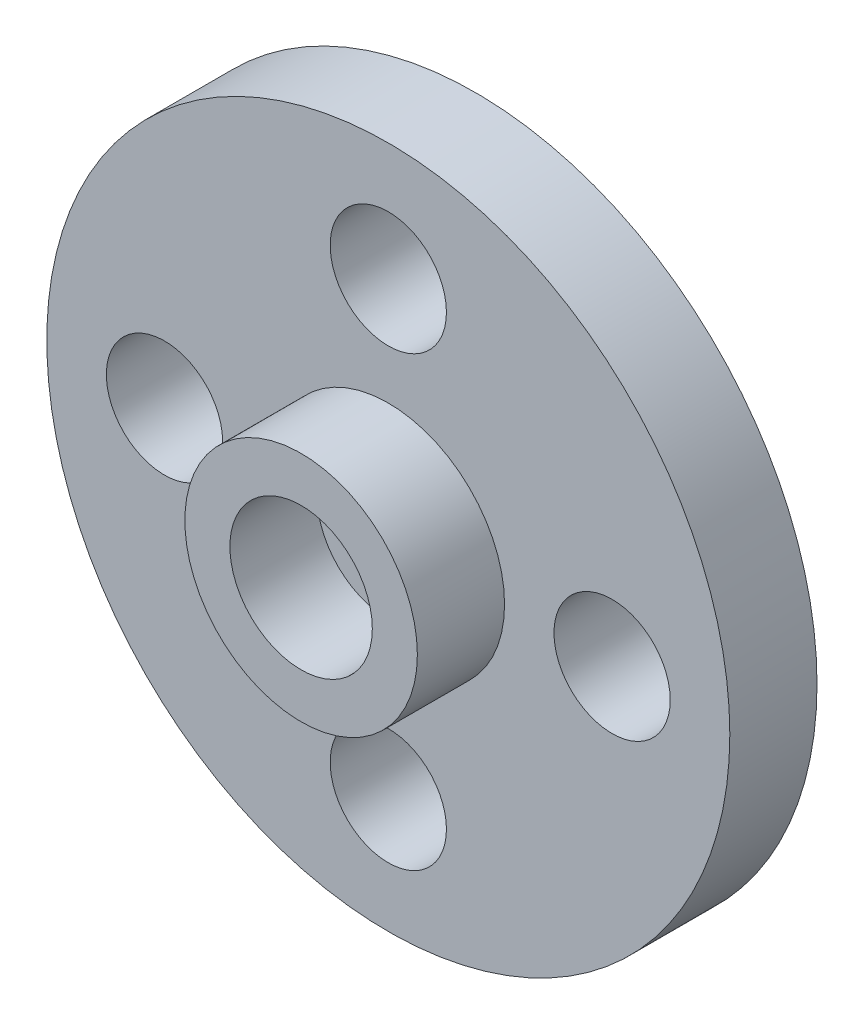
ISO-10303-21;
HEADER;
FILE_DESCRIPTION(('STEP AP214'),'2;1');
FILE_NAME('part.step','',(''),(''),'','','');
FILE_SCHEMA(('AUTOMOTIVE_DESIGN { 1 0 10303 214 1 1 1 1 }'));
ENDSEC;
DATA;
#1=APPLICATION_CONTEXT('core data for automotive mechanical design processes');
#2=APPLICATION_PROTOCOL_DEFINITION('international standard','automotive_design',2000,#1);
#3=PRODUCT_CONTEXT('',#1,'mechanical');
#4=PRODUCT('Part','Part','',(#3));
#5=PRODUCT_RELATED_PRODUCT_CATEGORY('part','',(#4));
#6=PRODUCT_DEFINITION_FORMATION('','',#4);
#7=PRODUCT_DEFINITION_CONTEXT('part definition',#1,'design');
#8=PRODUCT_DEFINITION('design','',#6,#7);
#9=PRODUCT_DEFINITION_SHAPE('','',#8);
#10=(LENGTH_UNIT() NAMED_UNIT(*) SI_UNIT(.MILLI.,.METRE.));
#11=(NAMED_UNIT(*) PLANE_ANGLE_UNIT() SI_UNIT($,.RADIAN.));
#12=(NAMED_UNIT(*) SI_UNIT($,.STERADIAN.) SOLID_ANGLE_UNIT());
#13=UNCERTAINTY_MEASURE_WITH_UNIT(LENGTH_MEASURE(1.E-05),#10,'distance_accuracy_value','');
#14=(GEOMETRIC_REPRESENTATION_CONTEXT(3) GLOBAL_UNCERTAINTY_ASSIGNED_CONTEXT((#13)) GLOBAL_UNIT_ASSIGNED_CONTEXT((#10,
#11,#12)) REPRESENTATION_CONTEXT('',''));
#15=CARTESIAN_POINT('',(0.,0.,0.));
#16=DIRECTION('',(0.,0.,1.));
#17=DIRECTION('',(1.,0.,0.));
#18=AXIS2_PLACEMENT_3D('',#15,#16,#17);
#19=CARTESIAN_POINT('',(0.,0.,-3.));
#20=DIRECTION('',(0.,0.,1.));
#21=DIRECTION('',(1.,0.,0.));
#22=AXIS2_PLACEMENT_3D('',#19,#20,#21);
#23=CYLINDRICAL_SURFACE('',#22,11.75);
#24=CARTESIAN_POINT('',(0.,0.,-3.));
#25=DIRECTION('',(0.,0.,1.));
#26=DIRECTION('',(1.,0.,0.));
#27=AXIS2_PLACEMENT_3D('',#24,#25,#26);
#28=CIRCLE('',#27,11.75);
#29=CARTESIAN_POINT('',(11.75,0.,-3.));
#30=VERTEX_POINT('',#29);
#31=EDGE_CURVE('E47',#30,#30,#28,.T.);
#32=ORIENTED_EDGE('',*,*,#31,.T.);
#33=EDGE_LOOP('',(#32));
#34=FACE_BOUND('',#33,.T.);
#35=CARTESIAN_POINT('',(0.,0.,0.));
#36=DIRECTION('',(0.,0.,1.));
#37=DIRECTION('',(1.,0.,0.));
#38=AXIS2_PLACEMENT_3D('',#35,#36,#37);
#39=CIRCLE('',#38,11.75);
#40=CARTESIAN_POINT('',(11.75,0.,0.));
#41=VERTEX_POINT('',#40);
#42=EDGE_CURVE('E51',#41,#41,#39,.T.);
#43=ORIENTED_EDGE('',*,*,#42,.F.);
#44=EDGE_LOOP('',(#43));
#45=FACE_BOUND('',#44,.T.);
#46=ADVANCED_FACE('F41',(#34,#45),#23,.T.);
#47=CARTESIAN_POINT('',(0.,0.,-3.));
#48=DIRECTION('',(0.,0.,1.));
#49=DIRECTION('',(1.,0.,0.));
#50=AXIS2_PLACEMENT_3D('',#47,#48,#49);
#51=PLANE('',#50);
#52=CARTESIAN_POINT('',(0.,7.7,-3.));
#53=DIRECTION('',(0.,0.,1.));
#54=DIRECTION('',(1.,0.,0.));
#55=AXIS2_PLACEMENT_3D('',#52,#53,#54);
#56=CIRCLE('',#55,2.);
#57=CARTESIAN_POINT('',(2.,7.7,-3.));
#58=VERTEX_POINT('',#57);
#59=EDGE_CURVE('E66',#58,#58,#56,.F.);
#60=ORIENTED_EDGE('',*,*,#59,.F.);
#61=EDGE_LOOP('',(#60));
#62=FACE_BOUND('',#61,.T.);
#63=CARTESIAN_POINT('',(7.70000000000011,1.05675171732646E-13,-3.));
#64=DIRECTION('',(0.,0.,1.));
#65=DIRECTION('',(1.,0.,0.));
#66=AXIS2_PLACEMENT_3D('',#63,#64,#65);
#67=CIRCLE('',#66,2.);
#68=CARTESIAN_POINT('',(9.70000000000011,1.05675171732646E-13,-3.));
#69=VERTEX_POINT('',#68);
#70=EDGE_CURVE('E82',#69,#69,#67,.F.);
#71=ORIENTED_EDGE('',*,*,#70,.F.);
#72=EDGE_LOOP('',(#71));
#73=FACE_BOUND('',#72,.T.);
#74=CARTESIAN_POINT('',(2.11350343465292E-13,-7.7,-3.));
#75=DIRECTION('',(0.,0.,1.));
#76=DIRECTION('',(1.,0.,0.));
#77=AXIS2_PLACEMENT_3D('',#74,#75,#76);
#78=CIRCLE('',#77,2.);
#79=CARTESIAN_POINT('',(2.00000000000021,-7.7,-3.));
#80=VERTEX_POINT('',#79);
#81=EDGE_CURVE('E76',#80,#80,#78,.F.);
#82=ORIENTED_EDGE('',*,*,#81,.F.);
#83=EDGE_LOOP('',(#82));
#84=FACE_BOUND('',#83,.T.);
#85=CARTESIAN_POINT('',(-7.6999999999999,-1.06618149767989E-13,-3.));
#86=DIRECTION('',(0.,0.,1.));
#87=DIRECTION('',(1.,0.,0.));
#88=AXIS2_PLACEMENT_3D('',#85,#86,#87);
#89=CIRCLE('',#88,2.);
#90=CARTESIAN_POINT('',(-5.69999999999989,-1.06618149767989E-13,-3.));
#91=VERTEX_POINT('',#90);
#92=EDGE_CURVE('E67',#91,#91,#89,.F.);
#93=ORIENTED_EDGE('',*,*,#92,.F.);
#94=EDGE_LOOP('',(#93));
#95=FACE_BOUND('',#94,.T.);
#96=ORIENTED_EDGE('',*,*,#31,.F.);
#97=EDGE_LOOP('',(#96));
#98=FACE_BOUND('',#97,.T.);
#99=ADVANCED_FACE('F100',(#62,#73,#84,#95,#98),#51,.F.);
#100=CARTESIAN_POINT('',(0.,0.,0.));
#101=DIRECTION('',(0.,0.,1.));
#102=DIRECTION('',(1.,0.,0.));
#103=AXIS2_PLACEMENT_3D('',#100,#101,#102);
#104=PLANE('',#103);
#105=CARTESIAN_POINT('',(0.,7.7,0.));
#106=DIRECTION('',(0.,0.,1.));
#107=DIRECTION('',(1.,0.,0.));
#108=AXIS2_PLACEMENT_3D('',#105,#106,#107);
#109=CIRCLE('',#108,2.);
#110=CARTESIAN_POINT('',(2.,7.7,0.));
#111=VERTEX_POINT('',#110);
#112=EDGE_CURVE('E85',#111,#111,#109,.T.);
#113=ORIENTED_EDGE('',*,*,#112,.F.);
#114=EDGE_LOOP('',(#113));
#115=FACE_BOUND('',#114,.T.);
#116=CARTESIAN_POINT('',(7.70000000000011,1.05675171732646E-13,0.));
#117=DIRECTION('',(0.,0.,1.));
#118=DIRECTION('',(1.,0.,0.));
#119=AXIS2_PLACEMENT_3D('',#116,#117,#118);
#120=CIRCLE('',#119,2.);
#121=CARTESIAN_POINT('',(9.70000000000011,1.05675171732646E-13,0.));
#122=VERTEX_POINT('',#121);
#123=EDGE_CURVE('E79',#122,#122,#120,.T.);
#124=ORIENTED_EDGE('',*,*,#123,.F.);
#125=EDGE_LOOP('',(#124));
#126=FACE_BOUND('',#125,.T.);
#127=CARTESIAN_POINT('',(2.11350343465292E-13,-7.7,0.));
#128=DIRECTION('',(0.,0.,1.));
#129=DIRECTION('',(1.,0.,0.));
#130=AXIS2_PLACEMENT_3D('',#127,#128,#129);
#131=CIRCLE('',#130,2.);
#132=CARTESIAN_POINT('',(2.00000000000021,-7.7,0.));
#133=VERTEX_POINT('',#132);
#134=EDGE_CURVE('E71',#133,#133,#131,.T.);
#135=ORIENTED_EDGE('',*,*,#134,.F.);
#136=EDGE_LOOP('',(#135));
#137=FACE_BOUND('',#136,.T.);
#138=CARTESIAN_POINT('',(-7.6999999999999,-1.06618149767989E-13,0.));
#139=DIRECTION('',(0.,0.,1.));
#140=DIRECTION('',(1.,0.,0.));
#141=AXIS2_PLACEMENT_3D('',#138,#139,#140);
#142=CIRCLE('',#141,2.);
#143=CARTESIAN_POINT('',(-5.69999999999989,-1.06618149767989E-13,0.));
#144=VERTEX_POINT('',#143);
#145=EDGE_CURVE('E72',#144,#144,#142,.T.);
#146=ORIENTED_EDGE('',*,*,#145,.F.);
#147=EDGE_LOOP('',(#146));
#148=FACE_BOUND('',#147,.T.);
#149=CARTESIAN_POINT('',(0.,0.,0.));
#150=DIRECTION('',(0.,0.,1.));
#151=DIRECTION('',(1.,0.,0.));
#152=AXIS2_PLACEMENT_3D('',#149,#150,#151);
#153=CIRCLE('',#152,4.);
#154=CARTESIAN_POINT('',(4.,0.,0.));
#155=VERTEX_POINT('',#154);
#156=EDGE_CURVE('E58',#155,#155,#153,.T.);
#157=ORIENTED_EDGE('',*,*,#156,.F.);
#158=EDGE_LOOP('',(#157));
#159=FACE_BOUND('',#158,.T.);
#160=ORIENTED_EDGE('',*,*,#42,.T.);
#161=EDGE_LOOP('',(#160));
#162=FACE_BOUND('',#161,.T.);
#163=ADVANCED_FACE('F96',(#115,#126,#137,#148,#159,#162),#104,.T.);
#164=CARTESIAN_POINT('',(0.,0.,3.));
#165=DIRECTION('',(0.,0.,1.));
#166=DIRECTION('',(1.,0.,0.));
#167=AXIS2_PLACEMENT_3D('',#164,#165,#166);
#168=PLANE('',#167);
#169=CARTESIAN_POINT('',(0.,0.,3.));
#170=DIRECTION('',(0.,0.,1.));
#171=DIRECTION('',(1.,0.,0.));
#172=AXIS2_PLACEMENT_3D('',#169,#170,#171);
#173=CIRCLE('',#172,4.);
#174=CARTESIAN_POINT('',(4.,0.,3.));
#175=VERTEX_POINT('',#174);
#176=EDGE_CURVE('E56',#175,#175,#173,.T.);
#177=ORIENTED_EDGE('',*,*,#176,.T.);
#178=EDGE_LOOP('',(#177));
#179=FACE_BOUND('',#178,.T.);
#180=CARTESIAN_POINT('',(0.,0.,3.));
#181=DIRECTION('',(0.,0.,1.));
#182=DIRECTION('',(1.,0.,0.));
#183=AXIS2_PLACEMENT_3D('',#180,#181,#182);
#184=CIRCLE('',#183,2.45);
#185=CARTESIAN_POINT('',(2.45,0.,3.));
#186=VERTEX_POINT('',#185);
#187=EDGE_CURVE('E61',#186,#186,#184,.T.);
#188=ORIENTED_EDGE('',*,*,#187,.F.);
#189=EDGE_LOOP('',(#188));
#190=FACE_BOUND('',#189,.T.);
#191=ADVANCED_FACE('F99',(#179,#190),#168,.T.);
#192=CARTESIAN_POINT('',(0.,0.,3.));
#193=DIRECTION('',(0.,0.,-1.));
#194=DIRECTION('',(-1.,0.,0.));
#195=AXIS2_PLACEMENT_3D('',#192,#193,#194);
#196=CYLINDRICAL_SURFACE('',#195,4.);
#197=ORIENTED_EDGE('',*,*,#176,.F.);
#198=EDGE_LOOP('',(#197));
#199=FACE_BOUND('',#198,.T.);
#200=ORIENTED_EDGE('',*,*,#156,.T.);
#201=EDGE_LOOP('',(#200));
#202=FACE_BOUND('',#201,.T.);
#203=ADVANCED_FACE('F123',(#199,#202),#196,.T.);
#204=CARTESIAN_POINT('',(0.,0.,3.));
#205=DIRECTION('',(0.,0.,-1.));
#206=DIRECTION('',(-1.,0.,0.));
#207=AXIS2_PLACEMENT_3D('',#204,#205,#206);
#208=CYLINDRICAL_SURFACE('',#207,2.45);
#209=ORIENTED_EDGE('',*,*,#187,.T.);
#210=EDGE_LOOP('',(#209));
#211=FACE_BOUND('',#210,.T.);
#212=CARTESIAN_POINT('',(0.,0.,0.));
#213=DIRECTION('',(0.,0.,1.));
#214=DIRECTION('',(1.,0.,0.));
#215=AXIS2_PLACEMENT_3D('',#212,#213,#214);
#216=CIRCLE('',#215,2.45);
#217=CARTESIAN_POINT('',(2.45,0.,0.));
#218=VERTEX_POINT('',#217);
#219=EDGE_CURVE('E10',#218,#218,#216,.F.);
#220=ORIENTED_EDGE('',*,*,#219,.T.);
#221=EDGE_LOOP('',(#220));
#222=FACE_BOUND('',#221,.T.);
#223=ADVANCED_FACE('F126',(#211,#222),#208,.F.);
#224=ORIENTED_EDGE('',*,*,#219,.F.);
#225=EDGE_LOOP('',(#224));
#226=FACE_BOUND('',#225,.T.);
#227=ADVANCED_FACE('F101',(#226),#104,.T.);
#228=CARTESIAN_POINT('',(-7.6999999999999,-1.06618149767989E-13,-3.001));
#229=DIRECTION('',(0.,0.,1.));
#230=DIRECTION('',(1.,0.,0.));
#231=AXIS2_PLACEMENT_3D('',#228,#229,#230);
#232=CYLINDRICAL_SURFACE('',#231,2.);
#233=CARTESIAN_POINT('',(-5.69999999999989,-1.06618149767989E-13,0.));
#234=CARTESIAN_POINT('',(-5.69999999999989,-1.06618149767989E-13,-0.0312500000000005));
#235=CARTESIAN_POINT('',(-5.69999999999989,-1.06618149767989E-13,-0.0625000000000005));
#236=CARTESIAN_POINT('',(-5.69999999999989,-1.06618149767989E-13,-0.125000000000001));
#237=CARTESIAN_POINT('',(-5.69999999999989,-1.06618149767989E-13,-0.156250000000001));
#238=CARTESIAN_POINT('',(-5.69999999999989,-1.06618149767989E-13,-0.218750000000001));
#239=CARTESIAN_POINT('',(-5.69999999999989,-1.06618149767989E-13,-0.250000000000001));
#240=CARTESIAN_POINT('',(-5.69999999999989,-1.06618149767989E-13,-0.312500000000001));
#241=CARTESIAN_POINT('',(-5.69999999999989,-1.06618149767989E-13,-0.34375));
#242=CARTESIAN_POINT('',(-5.69999999999989,-1.06618149767989E-13,-0.40625));
#243=CARTESIAN_POINT('',(-5.69999999999989,-1.06618149767989E-13,-0.4375));
#244=CARTESIAN_POINT('',(-5.69999999999989,-1.06618149767989E-13,-0.5));
#245=CARTESIAN_POINT('',(-5.69999999999989,-1.06618149767989E-13,-0.53125));
#246=CARTESIAN_POINT('',(-5.69999999999989,-1.06618149767989E-13,-0.593750000000001));
#247=CARTESIAN_POINT('',(-5.69999999999989,-1.06618149767989E-13,-0.625000000000001));
#248=CARTESIAN_POINT('',(-5.69999999999989,-1.06618149767989E-13,-0.687500000000001));
#249=CARTESIAN_POINT('',(-5.69999999999989,-1.06618149767989E-13,-0.71875));
#250=CARTESIAN_POINT('',(-5.69999999999989,-1.06618149767989E-13,-0.78125));
#251=CARTESIAN_POINT('',(-5.69999999999989,-1.06618149767989E-13,-0.8125));
#252=CARTESIAN_POINT('',(-5.69999999999989,-1.06618149767989E-13,-0.875));
#253=CARTESIAN_POINT('',(-5.69999999999989,-1.06618149767989E-13,-0.90625));
#254=CARTESIAN_POINT('',(-5.69999999999989,-1.06618149767989E-13,-0.96875));
#255=CARTESIAN_POINT('',(-5.69999999999989,-1.06618149767989E-13,-1.));
#256=CARTESIAN_POINT('',(-5.69999999999989,-1.06618149767989E-13,-1.0625));
#257=CARTESIAN_POINT('',(-5.69999999999989,-1.06618149767989E-13,-1.09375));
#258=CARTESIAN_POINT('',(-5.69999999999989,-1.06618149767989E-13,-1.15625));
#259=CARTESIAN_POINT('',(-5.69999999999989,-1.06618149767989E-13,-1.1875));
#260=CARTESIAN_POINT('',(-5.69999999999989,-1.06618149767989E-13,-1.25));
#261=CARTESIAN_POINT('',(-5.69999999999989,-1.06618149767989E-13,-1.28125));
#262=CARTESIAN_POINT('',(-5.69999999999989,-1.06618149767989E-13,-1.34375));
#263=CARTESIAN_POINT('',(-5.69999999999989,-1.06618149767989E-13,-1.375));
#264=CARTESIAN_POINT('',(-5.69999999999989,-1.06618149767989E-13,-1.4375));
#265=CARTESIAN_POINT('',(-5.69999999999989,-1.06618149767989E-13,-1.46875));
#266=CARTESIAN_POINT('',(-5.69999999999989,-1.06618149767989E-13,-1.53125));
#267=CARTESIAN_POINT('',(-5.69999999999989,-1.06618149767989E-13,-1.5625));
#268=CARTESIAN_POINT('',(-5.69999999999989,-1.06618149767989E-13,-1.625));
#269=CARTESIAN_POINT('',(-5.69999999999989,-1.06618149767989E-13,-1.65625));
#270=CARTESIAN_POINT('',(-5.69999999999989,-1.06618149767989E-13,-1.71875));
#271=CARTESIAN_POINT('',(-5.69999999999989,-1.06618149767989E-13,-1.75));
#272=CARTESIAN_POINT('',(-5.69999999999989,-1.06618149767989E-13,-1.8125));
#273=CARTESIAN_POINT('',(-5.69999999999989,-1.06618149767989E-13,-1.84375));
#274=CARTESIAN_POINT('',(-5.69999999999989,-1.06618149767989E-13,-1.90625));
#275=CARTESIAN_POINT('',(-5.69999999999989,-1.06618149767989E-13,-1.9375));
#276=CARTESIAN_POINT('',(-5.69999999999989,-1.06618149767989E-13,-2.));
#277=CARTESIAN_POINT('',(-5.69999999999989,-1.06618149767989E-13,-2.03125));
#278=CARTESIAN_POINT('',(-5.69999999999989,-1.06618149767989E-13,-2.09375));
#279=CARTESIAN_POINT('',(-5.69999999999989,-1.06618149767989E-13,-2.125));
#280=CARTESIAN_POINT('',(-5.69999999999989,-1.06618149767989E-13,-2.1875));
#281=CARTESIAN_POINT('',(-5.69999999999989,-1.06618149767989E-13,-2.21875));
#282=CARTESIAN_POINT('',(-5.69999999999989,-1.06618149767989E-13,-2.28125));
#283=CARTESIAN_POINT('',(-5.69999999999989,-1.06618149767989E-13,-2.3125));
#284=CARTESIAN_POINT('',(-5.69999999999989,-1.06618149767989E-13,-2.375));
#285=CARTESIAN_POINT('',(-5.69999999999989,-1.06618149767989E-13,-2.40625));
#286=CARTESIAN_POINT('',(-5.69999999999989,-1.06618149767989E-13,-2.46875));
#287=CARTESIAN_POINT('',(-5.69999999999989,-1.06618149767989E-13,-2.5));
#288=CARTESIAN_POINT('',(-5.69999999999989,-1.06618149767989E-13,-2.5625));
#289=CARTESIAN_POINT('',(-5.69999999999989,-1.06618149767989E-13,-2.59375));
#290=CARTESIAN_POINT('',(-5.69999999999989,-1.06618149767989E-13,-2.65625));
#291=CARTESIAN_POINT('',(-5.69999999999989,-1.06618149767989E-13,-2.6875));
#292=CARTESIAN_POINT('',(-5.69999999999989,-1.06618149767989E-13,-2.75));
#293=CARTESIAN_POINT('',(-5.69999999999989,-1.06618149767989E-13,-2.78125));
#294=CARTESIAN_POINT('',(-5.69999999999989,-1.06618149767989E-13,-2.84375));
#295=CARTESIAN_POINT('',(-5.69999999999989,-1.06618149767989E-13,-2.875));
#296=CARTESIAN_POINT('',(-5.69999999999989,-1.06618149767989E-13,-2.9375));
#297=CARTESIAN_POINT('',(-5.69999999999989,-1.06618149767989E-13,-2.96875));
#298=CARTESIAN_POINT('',(-5.69999999999989,-1.06618149767989E-13,-3.));
#299=B_SPLINE_CURVE_WITH_KNOTS('',3,(#233,#234,#235,#236,#237,#238,#239,#240,#241,#242,#243,
#244,#245,#246,#247,#248,#249,#250,#251,#252,#253,#254,#255,#256,#257,#258,#259,#260,#261,#262,
#263,#264,#265,#266,#267,#268,#269,#270,#271,#272,#273,#274,#275,#276,#277,#278,#279,#280,#281,
#282,#283,#284,#285,#286,#287,#288,#289,#290,#291,#292,#293,#294,#295,#296,#297,#298),
.UNSPECIFIED.,.F.,.F.,(4,2,2,2,2,2,2,2,2,2,2,2,2,2,2,2,2,2,2,2,2,2,2,2,2,2,2,2,2,2,2,2,4),(0.,
0.0937500000000001,0.1875,0.28125,0.375,0.46875,0.5625,0.65625,0.75,0.84375,0.9375,1.03125,
1.125,1.21875,1.3125,1.40625,1.5,1.59375,1.6875,1.78125,1.875,1.96875,2.0625,2.15625,2.25,
2.34375,2.4375,2.53125,2.625,2.71875,2.8125,2.90625,3.),.UNSPECIFIED.);
#300=EDGE_CURVE('BSEAM134',#144,#91,#299,.T.);
#301=ORIENTED_EDGE('',*,*,#145,.T.);
#302=ORIENTED_EDGE('',*,*,#92,.T.);
#303=ORIENTED_EDGE('',*,*,#300,.T.);
#304=ORIENTED_EDGE('',*,*,#300,.F.);
#305=EDGE_LOOP('',(#301,#303,#302,#304));
#306=FACE_BOUND('',#305,.T.);
#307=ADVANCED_FACE('F134',(#306),#232,.F.);
#308=CARTESIAN_POINT('',(2.11350343465292E-13,-7.7,-3.001));
#309=DIRECTION('',(0.,0.,1.));
#310=DIRECTION('',(1.,0.,0.));
#311=AXIS2_PLACEMENT_3D('',#308,#309,#310);
#312=CYLINDRICAL_SURFACE('',#311,2.);
#313=CARTESIAN_POINT('',(2.00000000000021,-7.7,0.));
#314=CARTESIAN_POINT('',(2.00000000000021,-7.7,-0.0312500000000005));
#315=CARTESIAN_POINT('',(2.00000000000021,-7.7,-0.0625000000000005));
#316=CARTESIAN_POINT('',(2.00000000000021,-7.7,-0.125000000000001));
#317=CARTESIAN_POINT('',(2.00000000000021,-7.7,-0.156250000000001));
#318=CARTESIAN_POINT('',(2.00000000000021,-7.7,-0.218750000000001));
#319=CARTESIAN_POINT('',(2.00000000000021,-7.7,-0.250000000000001));
#320=CARTESIAN_POINT('',(2.00000000000021,-7.7,-0.312500000000001));
#321=CARTESIAN_POINT('',(2.00000000000021,-7.7,-0.34375));
#322=CARTESIAN_POINT('',(2.00000000000021,-7.7,-0.40625));
#323=CARTESIAN_POINT('',(2.00000000000021,-7.7,-0.4375));
#324=CARTESIAN_POINT('',(2.00000000000021,-7.7,-0.5));
#325=CARTESIAN_POINT('',(2.00000000000021,-7.7,-0.53125));
#326=CARTESIAN_POINT('',(2.00000000000021,-7.7,-0.593750000000001));
#327=CARTESIAN_POINT('',(2.00000000000021,-7.7,-0.625000000000001));
#328=CARTESIAN_POINT('',(2.00000000000021,-7.7,-0.687500000000001));
#329=CARTESIAN_POINT('',(2.00000000000021,-7.7,-0.71875));
#330=CARTESIAN_POINT('',(2.00000000000021,-7.7,-0.78125));
#331=CARTESIAN_POINT('',(2.00000000000021,-7.7,-0.8125));
#332=CARTESIAN_POINT('',(2.00000000000021,-7.7,-0.875));
#333=CARTESIAN_POINT('',(2.00000000000021,-7.7,-0.90625));
#334=CARTESIAN_POINT('',(2.00000000000021,-7.7,-0.96875));
#335=CARTESIAN_POINT('',(2.00000000000021,-7.7,-1.));
#336=CARTESIAN_POINT('',(2.00000000000021,-7.7,-1.0625));
#337=CARTESIAN_POINT('',(2.00000000000021,-7.7,-1.09375));
#338=CARTESIAN_POINT('',(2.00000000000021,-7.7,-1.15625));
#339=CARTESIAN_POINT('',(2.00000000000021,-7.7,-1.1875));
#340=CARTESIAN_POINT('',(2.00000000000021,-7.7,-1.25));
#341=CARTESIAN_POINT('',(2.00000000000021,-7.7,-1.28125));
#342=CARTESIAN_POINT('',(2.00000000000021,-7.7,-1.34375));
#343=CARTESIAN_POINT('',(2.00000000000021,-7.7,-1.375));
#344=CARTESIAN_POINT('',(2.00000000000021,-7.7,-1.4375));
#345=CARTESIAN_POINT('',(2.00000000000021,-7.7,-1.46875));
#346=CARTESIAN_POINT('',(2.00000000000021,-7.7,-1.53125));
#347=CARTESIAN_POINT('',(2.00000000000021,-7.7,-1.5625));
#348=CARTESIAN_POINT('',(2.00000000000021,-7.7,-1.625));
#349=CARTESIAN_POINT('',(2.00000000000021,-7.7,-1.65625));
#350=CARTESIAN_POINT('',(2.00000000000021,-7.7,-1.71875));
#351=CARTESIAN_POINT('',(2.00000000000021,-7.7,-1.75));
#352=CARTESIAN_POINT('',(2.00000000000021,-7.7,-1.8125));
#353=CARTESIAN_POINT('',(2.00000000000021,-7.7,-1.84375));
#354=CARTESIAN_POINT('',(2.00000000000021,-7.7,-1.90625));
#355=CARTESIAN_POINT('',(2.00000000000021,-7.7,-1.9375));
#356=CARTESIAN_POINT('',(2.00000000000021,-7.7,-2.));
#357=CARTESIAN_POINT('',(2.00000000000021,-7.7,-2.03125));
#358=CARTESIAN_POINT('',(2.00000000000021,-7.7,-2.09375));
#359=CARTESIAN_POINT('',(2.00000000000021,-7.7,-2.125));
#360=CARTESIAN_POINT('',(2.00000000000021,-7.7,-2.1875));
#361=CARTESIAN_POINT('',(2.00000000000021,-7.7,-2.21875));
#362=CARTESIAN_POINT('',(2.00000000000021,-7.7,-2.28125));
#363=CARTESIAN_POINT('',(2.00000000000021,-7.7,-2.3125));
#364=CARTESIAN_POINT('',(2.00000000000021,-7.7,-2.375));
#365=CARTESIAN_POINT('',(2.00000000000021,-7.7,-2.40625));
#366=CARTESIAN_POINT('',(2.00000000000021,-7.7,-2.46875));
#367=CARTESIAN_POINT('',(2.00000000000021,-7.7,-2.5));
#368=CARTESIAN_POINT('',(2.00000000000021,-7.7,-2.5625));
#369=CARTESIAN_POINT('',(2.00000000000021,-7.7,-2.59375));
#370=CARTESIAN_POINT('',(2.00000000000021,-7.7,-2.65625));
#371=CARTESIAN_POINT('',(2.00000000000021,-7.7,-2.6875));
#372=CARTESIAN_POINT('',(2.00000000000021,-7.7,-2.75));
#373=CARTESIAN_POINT('',(2.00000000000021,-7.7,-2.78125));
#374=CARTESIAN_POINT('',(2.00000000000021,-7.7,-2.84375));
#375=CARTESIAN_POINT('',(2.00000000000021,-7.7,-2.875));
#376=CARTESIAN_POINT('',(2.00000000000021,-7.7,-2.9375));
#377=CARTESIAN_POINT('',(2.00000000000021,-7.7,-2.96875));
#378=CARTESIAN_POINT('',(2.00000000000021,-7.7,-3.));
#379=B_SPLINE_CURVE_WITH_KNOTS('',3,(#313,#314,#315,#316,#317,#318,#319,#320,#321,#322,#323,
#324,#325,#326,#327,#328,#329,#330,#331,#332,#333,#334,#335,#336,#337,#338,#339,#340,#341,#342,
#343,#344,#345,#346,#347,#348,#349,#350,#351,#352,#353,#354,#355,#356,#357,#358,#359,#360,#361,
#362,#363,#364,#365,#366,#367,#368,#369,#370,#371,#372,#373,#374,#375,#376,#377,#378),
.UNSPECIFIED.,.F.,.F.,(4,2,2,2,2,2,2,2,2,2,2,2,2,2,2,2,2,2,2,2,2,2,2,2,2,2,2,2,2,2,2,2,4),(0.,
0.0937500000000001,0.1875,0.28125,0.375,0.46875,0.5625,0.65625,0.75,0.84375,0.9375,1.03125,
1.125,1.21875,1.3125,1.40625,1.5,1.59375,1.6875,1.78125,1.875,1.96875,2.0625,2.15625,2.25,
2.34375,2.4375,2.53125,2.625,2.71875,2.8125,2.90625,3.),.UNSPECIFIED.);
#380=EDGE_CURVE('BSEAM137',#133,#80,#379,.T.);
#381=ORIENTED_EDGE('',*,*,#134,.T.);
#382=ORIENTED_EDGE('',*,*,#81,.T.);
#383=ORIENTED_EDGE('',*,*,#380,.T.);
#384=ORIENTED_EDGE('',*,*,#380,.F.);
#385=EDGE_LOOP('',(#381,#383,#382,#384));
#386=FACE_BOUND('',#385,.T.);
#387=ADVANCED_FACE('F137',(#386),#312,.F.);
#388=CARTESIAN_POINT('',(7.70000000000011,1.05675171732646E-13,-3.001));
#389=DIRECTION('',(0.,0.,1.));
#390=DIRECTION('',(1.,0.,0.));
#391=AXIS2_PLACEMENT_3D('',#388,#389,#390);
#392=CYLINDRICAL_SURFACE('',#391,2.);
#393=CARTESIAN_POINT('',(9.70000000000011,1.05675171732646E-13,0.));
#394=CARTESIAN_POINT('',(9.70000000000011,1.05675171732646E-13,-0.0312500000000005));
#395=CARTESIAN_POINT('',(9.70000000000011,1.05675171732646E-13,-0.0625000000000005));
#396=CARTESIAN_POINT('',(9.70000000000011,1.05675171732646E-13,-0.125000000000001));
#397=CARTESIAN_POINT('',(9.70000000000011,1.05675171732646E-13,-0.156250000000001));
#398=CARTESIAN_POINT('',(9.70000000000011,1.05675171732646E-13,-0.218750000000001));
#399=CARTESIAN_POINT('',(9.70000000000011,1.05675171732646E-13,-0.250000000000001));
#400=CARTESIAN_POINT('',(9.70000000000011,1.05675171732646E-13,-0.312500000000001));
#401=CARTESIAN_POINT('',(9.70000000000011,1.05675171732646E-13,-0.34375));
#402=CARTESIAN_POINT('',(9.70000000000011,1.05675171732646E-13,-0.40625));
#403=CARTESIAN_POINT('',(9.70000000000011,1.05675171732646E-13,-0.4375));
#404=CARTESIAN_POINT('',(9.70000000000011,1.05675171732646E-13,-0.5));
#405=CARTESIAN_POINT('',(9.70000000000011,1.05675171732646E-13,-0.53125));
#406=CARTESIAN_POINT('',(9.70000000000011,1.05675171732646E-13,-0.593750000000001));
#407=CARTESIAN_POINT('',(9.70000000000011,1.05675171732646E-13,-0.625000000000001));
#408=CARTESIAN_POINT('',(9.70000000000011,1.05675171732646E-13,-0.687500000000001));
#409=CARTESIAN_POINT('',(9.70000000000011,1.05675171732646E-13,-0.71875));
#410=CARTESIAN_POINT('',(9.70000000000011,1.05675171732646E-13,-0.78125));
#411=CARTESIAN_POINT('',(9.70000000000011,1.05675171732646E-13,-0.8125));
#412=CARTESIAN_POINT('',(9.70000000000011,1.05675171732646E-13,-0.875));
#413=CARTESIAN_POINT('',(9.70000000000011,1.05675171732646E-13,-0.90625));
#414=CARTESIAN_POINT('',(9.70000000000011,1.05675171732646E-13,-0.96875));
#415=CARTESIAN_POINT('',(9.70000000000011,1.05675171732646E-13,-1.));
#416=CARTESIAN_POINT('',(9.70000000000011,1.05675171732646E-13,-1.0625));
#417=CARTESIAN_POINT('',(9.70000000000011,1.05675171732646E-13,-1.09375));
#418=CARTESIAN_POINT('',(9.70000000000011,1.05675171732646E-13,-1.15625));
#419=CARTESIAN_POINT('',(9.70000000000011,1.05675171732646E-13,-1.1875));
#420=CARTESIAN_POINT('',(9.70000000000011,1.05675171732646E-13,-1.25));
#421=CARTESIAN_POINT('',(9.70000000000011,1.05675171732646E-13,-1.28125));
#422=CARTESIAN_POINT('',(9.70000000000011,1.05675171732646E-13,-1.34375));
#423=CARTESIAN_POINT('',(9.70000000000011,1.05675171732646E-13,-1.375));
#424=CARTESIAN_POINT('',(9.70000000000011,1.05675171732646E-13,-1.4375));
#425=CARTESIAN_POINT('',(9.70000000000011,1.05675171732646E-13,-1.46875));
#426=CARTESIAN_POINT('',(9.70000000000011,1.05675171732646E-13,-1.53125));
#427=CARTESIAN_POINT('',(9.70000000000011,1.05675171732646E-13,-1.5625));
#428=CARTESIAN_POINT('',(9.70000000000011,1.05675171732646E-13,-1.625));
#429=CARTESIAN_POINT('',(9.70000000000011,1.05675171732646E-13,-1.65625));
#430=CARTESIAN_POINT('',(9.70000000000011,1.05675171732646E-13,-1.71875));
#431=CARTESIAN_POINT('',(9.70000000000011,1.05675171732646E-13,-1.75));
#432=CARTESIAN_POINT('',(9.70000000000011,1.05675171732646E-13,-1.8125));
#433=CARTESIAN_POINT('',(9.70000000000011,1.05675171732646E-13,-1.84375));
#434=CARTESIAN_POINT('',(9.70000000000011,1.05675171732646E-13,-1.90625));
#435=CARTESIAN_POINT('',(9.70000000000011,1.05675171732646E-13,-1.9375));
#436=CARTESIAN_POINT('',(9.70000000000011,1.05675171732646E-13,-2.));
#437=CARTESIAN_POINT('',(9.70000000000011,1.05675171732646E-13,-2.03125));
#438=CARTESIAN_POINT('',(9.70000000000011,1.05675171732646E-13,-2.09375));
#439=CARTESIAN_POINT('',(9.70000000000011,1.05675171732646E-13,-2.125));
#440=CARTESIAN_POINT('',(9.70000000000011,1.05675171732646E-13,-2.1875));
#441=CARTESIAN_POINT('',(9.70000000000011,1.05675171732646E-13,-2.21875));
#442=CARTESIAN_POINT('',(9.70000000000011,1.05675171732646E-13,-2.28125));
#443=CARTESIAN_POINT('',(9.70000000000011,1.05675171732646E-13,-2.3125));
#444=CARTESIAN_POINT('',(9.70000000000011,1.05675171732646E-13,-2.375));
#445=CARTESIAN_POINT('',(9.70000000000011,1.05675171732646E-13,-2.40625));
#446=CARTESIAN_POINT('',(9.70000000000011,1.05675171732646E-13,-2.46875));
#447=CARTESIAN_POINT('',(9.70000000000011,1.05675171732646E-13,-2.5));
#448=CARTESIAN_POINT('',(9.70000000000011,1.05675171732646E-13,-2.5625));
#449=CARTESIAN_POINT('',(9.70000000000011,1.05675171732646E-13,-2.59375));
#450=CARTESIAN_POINT('',(9.70000000000011,1.05675171732646E-13,-2.65625));
#451=CARTESIAN_POINT('',(9.70000000000011,1.05675171732646E-13,-2.6875));
#452=CARTESIAN_POINT('',(9.70000000000011,1.05675171732646E-13,-2.75));
#453=CARTESIAN_POINT('',(9.70000000000011,1.05675171732646E-13,-2.78125));
#454=CARTESIAN_POINT('',(9.70000000000011,1.05675171732646E-13,-2.84375));
#455=CARTESIAN_POINT('',(9.70000000000011,1.05675171732646E-13,-2.875));
#456=CARTESIAN_POINT('',(9.70000000000011,1.05675171732646E-13,-2.9375));
#457=CARTESIAN_POINT('',(9.70000000000011,1.05675171732646E-13,-2.96875));
#458=CARTESIAN_POINT('',(9.70000000000011,1.05675171732646E-13,-3.));
#459=B_SPLINE_CURVE_WITH_KNOTS('',3,(#393,#394,#395,#396,#397,#398,#399,#400,#401,#402,#403,
#404,#405,#406,#407,#408,#409,#410,#411,#412,#413,#414,#415,#416,#417,#418,#419,#420,#421,#422,
#423,#424,#425,#426,#427,#428,#429,#430,#431,#432,#433,#434,#435,#436,#437,#438,#439,#440,#441,
#442,#443,#444,#445,#446,#447,#448,#449,#450,#451,#452,#453,#454,#455,#456,#457,#458),
.UNSPECIFIED.,.F.,.F.,(4,2,2,2,2,2,2,2,2,2,2,2,2,2,2,2,2,2,2,2,2,2,2,2,2,2,2,2,2,2,2,2,4),(0.,
0.0937500000000001,0.1875,0.28125,0.375,0.46875,0.5625,0.65625,0.75,0.84375,0.9375,1.03125,
1.125,1.21875,1.3125,1.40625,1.5,1.59375,1.6875,1.78125,1.875,1.96875,2.0625,2.15625,2.25,
2.34375,2.4375,2.53125,2.625,2.71875,2.8125,2.90625,3.),.UNSPECIFIED.);
#460=EDGE_CURVE('BSEAM141',#122,#69,#459,.T.);
#461=ORIENTED_EDGE('',*,*,#123,.T.);
#462=ORIENTED_EDGE('',*,*,#70,.T.);
#463=ORIENTED_EDGE('',*,*,#460,.T.);
#464=ORIENTED_EDGE('',*,*,#460,.F.);
#465=EDGE_LOOP('',(#461,#463,#462,#464));
#466=FACE_BOUND('',#465,.T.);
#467=ADVANCED_FACE('F141',(#466),#392,.F.);
#468=CARTESIAN_POINT('',(0.,7.7,-3.001));
#469=DIRECTION('',(0.,0.,1.));
#470=DIRECTION('',(1.,0.,0.));
#471=AXIS2_PLACEMENT_3D('',#468,#469,#470);
#472=CYLINDRICAL_SURFACE('',#471,2.);
#473=CARTESIAN_POINT('',(2.,7.7,0.));
#474=CARTESIAN_POINT('',(2.,7.7,-0.0312500000000005));
#475=CARTESIAN_POINT('',(2.,7.7,-0.0625000000000005));
#476=CARTESIAN_POINT('',(2.,7.7,-0.125000000000001));
#477=CARTESIAN_POINT('',(2.,7.7,-0.156250000000001));
#478=CARTESIAN_POINT('',(2.,7.7,-0.218750000000001));
#479=CARTESIAN_POINT('',(2.,7.7,-0.250000000000001));
#480=CARTESIAN_POINT('',(2.,7.7,-0.312500000000001));
#481=CARTESIAN_POINT('',(2.,7.7,-0.34375));
#482=CARTESIAN_POINT('',(2.,7.7,-0.40625));
#483=CARTESIAN_POINT('',(2.,7.7,-0.4375));
#484=CARTESIAN_POINT('',(2.,7.7,-0.5));
#485=CARTESIAN_POINT('',(2.,7.7,-0.53125));
#486=CARTESIAN_POINT('',(2.,7.7,-0.593750000000001));
#487=CARTESIAN_POINT('',(2.,7.7,-0.625000000000001));
#488=CARTESIAN_POINT('',(2.,7.7,-0.687500000000001));
#489=CARTESIAN_POINT('',(2.,7.7,-0.71875));
#490=CARTESIAN_POINT('',(2.,7.7,-0.78125));
#491=CARTESIAN_POINT('',(2.,7.7,-0.8125));
#492=CARTESIAN_POINT('',(2.,7.7,-0.875));
#493=CARTESIAN_POINT('',(2.,7.7,-0.90625));
#494=CARTESIAN_POINT('',(2.,7.7,-0.96875));
#495=CARTESIAN_POINT('',(2.,7.7,-1.));
#496=CARTESIAN_POINT('',(2.,7.7,-1.0625));
#497=CARTESIAN_POINT('',(2.,7.7,-1.09375));
#498=CARTESIAN_POINT('',(2.,7.7,-1.15625));
#499=CARTESIAN_POINT('',(2.,7.7,-1.1875));
#500=CARTESIAN_POINT('',(2.,7.7,-1.25));
#501=CARTESIAN_POINT('',(2.,7.7,-1.28125));
#502=CARTESIAN_POINT('',(2.,7.7,-1.34375));
#503=CARTESIAN_POINT('',(2.,7.7,-1.375));
#504=CARTESIAN_POINT('',(2.,7.7,-1.4375));
#505=CARTESIAN_POINT('',(2.,7.7,-1.46875));
#506=CARTESIAN_POINT('',(2.,7.7,-1.53125));
#507=CARTESIAN_POINT('',(2.,7.7,-1.5625));
#508=CARTESIAN_POINT('',(2.,7.7,-1.625));
#509=CARTESIAN_POINT('',(2.,7.7,-1.65625));
#510=CARTESIAN_POINT('',(2.,7.7,-1.71875));
#511=CARTESIAN_POINT('',(2.,7.7,-1.75));
#512=CARTESIAN_POINT('',(2.,7.7,-1.8125));
#513=CARTESIAN_POINT('',(2.,7.7,-1.84375));
#514=CARTESIAN_POINT('',(2.,7.7,-1.90625));
#515=CARTESIAN_POINT('',(2.,7.7,-1.9375));
#516=CARTESIAN_POINT('',(2.,7.7,-2.));
#517=CARTESIAN_POINT('',(2.,7.7,-2.03125));
#518=CARTESIAN_POINT('',(2.,7.7,-2.09375));
#519=CARTESIAN_POINT('',(2.,7.7,-2.125));
#520=CARTESIAN_POINT('',(2.,7.7,-2.1875));
#521=CARTESIAN_POINT('',(2.,7.7,-2.21875));
#522=CARTESIAN_POINT('',(2.,7.7,-2.28125));
#523=CARTESIAN_POINT('',(2.,7.7,-2.3125));
#524=CARTESIAN_POINT('',(2.,7.7,-2.375));
#525=CARTESIAN_POINT('',(2.,7.7,-2.40625));
#526=CARTESIAN_POINT('',(2.,7.7,-2.46875));
#527=CARTESIAN_POINT('',(2.,7.7,-2.5));
#528=CARTESIAN_POINT('',(2.,7.7,-2.5625));
#529=CARTESIAN_POINT('',(2.,7.7,-2.59375));
#530=CARTESIAN_POINT('',(2.,7.7,-2.65625));
#531=CARTESIAN_POINT('',(2.,7.7,-2.6875));
#532=CARTESIAN_POINT('',(2.,7.7,-2.75));
#533=CARTESIAN_POINT('',(2.,7.7,-2.78125));
#534=CARTESIAN_POINT('',(2.,7.7,-2.84375));
#535=CARTESIAN_POINT('',(2.,7.7,-2.875));
#536=CARTESIAN_POINT('',(2.,7.7,-2.9375));
#537=CARTESIAN_POINT('',(2.,7.7,-2.96875));
#538=CARTESIAN_POINT('',(2.,7.7,-3.));
#539=B_SPLINE_CURVE_WITH_KNOTS('',3,(#473,#474,#475,#476,#477,#478,#479,#480,#481,#482,#483,
#484,#485,#486,#487,#488,#489,#490,#491,#492,#493,#494,#495,#496,#497,#498,#499,#500,#501,#502,
#503,#504,#505,#506,#507,#508,#509,#510,#511,#512,#513,#514,#515,#516,#517,#518,#519,#520,#521,
#522,#523,#524,#525,#526,#527,#528,#529,#530,#531,#532,#533,#534,#535,#536,#537,#538),
.UNSPECIFIED.,.F.,.F.,(4,2,2,2,2,2,2,2,2,2,2,2,2,2,2,2,2,2,2,2,2,2,2,2,2,2,2,2,2,2,2,2,4),(0.,
0.0937500000000001,0.1875,0.28125,0.375,0.46875,0.5625,0.65625,0.75,0.84375,0.9375,1.03125,
1.125,1.21875,1.3125,1.40625,1.5,1.59375,1.6875,1.78125,1.875,1.96875,2.0625,2.15625,2.25,
2.34375,2.4375,2.53125,2.625,2.71875,2.8125,2.90625,3.),.UNSPECIFIED.);
#540=EDGE_CURVE('BSEAM93',#111,#58,#539,.T.);
#541=ORIENTED_EDGE('',*,*,#112,.T.);
#542=ORIENTED_EDGE('',*,*,#59,.T.);
#543=ORIENTED_EDGE('',*,*,#540,.T.);
#544=ORIENTED_EDGE('',*,*,#540,.F.);
#545=EDGE_LOOP('',(#541,#543,#542,#544));
#546=FACE_BOUND('',#545,.T.);
#547=ADVANCED_FACE('F93',(#546),#472,.F.);
#548=CLOSED_SHELL('',(#46,#99,#163,#191,#203,#223,#227,#307,#387,#467,#547));
#549=MANIFOLD_SOLID_BREP('B2',#548);
#550=ADVANCED_BREP_SHAPE_REPRESENTATION('',(#18,#549),#14);
#551=SHAPE_DEFINITION_REPRESENTATION(#9,#550);
ENDSEC;
END-ISO-10303-21;
